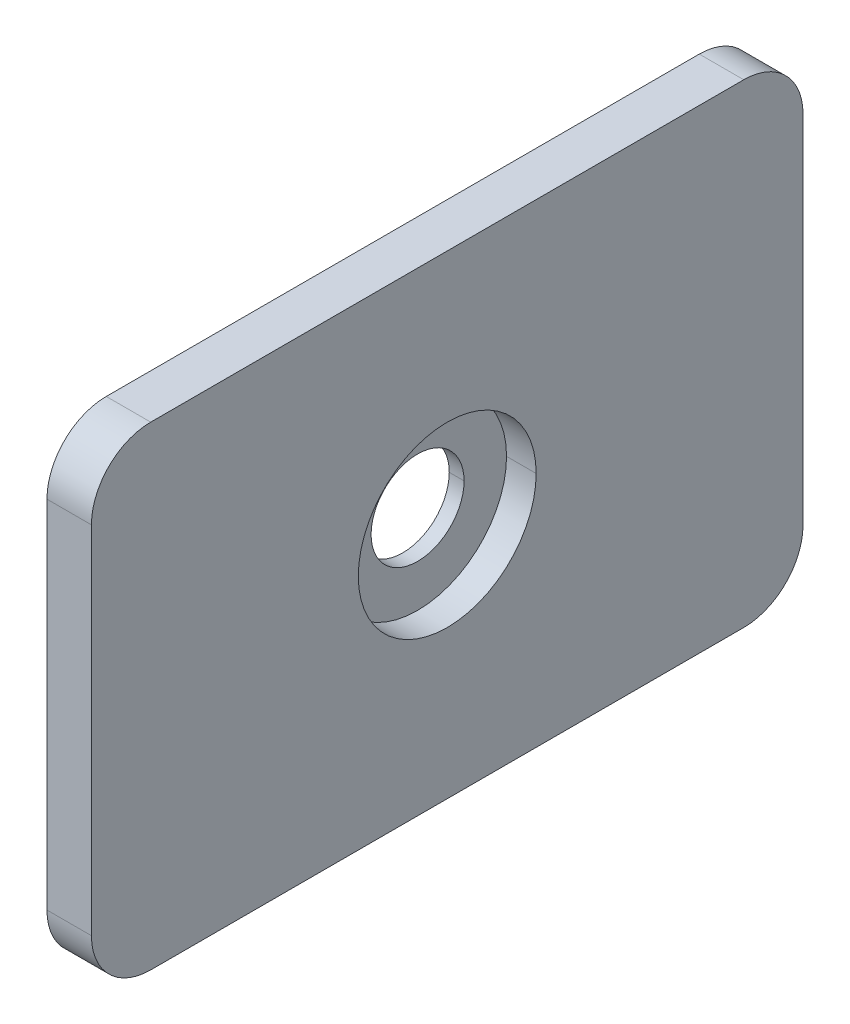
ISO-10303-21;
HEADER;
FILE_DESCRIPTION(('STEP AP214'),'2;1');
FILE_NAME('part.step','',(''),(''),'','','');
FILE_SCHEMA(('AUTOMOTIVE_DESIGN { 1 0 10303 214 1 1 1 1 }'));
ENDSEC;
DATA;
#1=APPLICATION_CONTEXT('core data for automotive mechanical design processes');
#2=APPLICATION_PROTOCOL_DEFINITION('international standard','automotive_design',2000,#1);
#3=PRODUCT_CONTEXT('',#1,'mechanical');
#4=PRODUCT('Part','Part','',(#3));
#5=PRODUCT_RELATED_PRODUCT_CATEGORY('part','',(#4));
#6=PRODUCT_DEFINITION_FORMATION('','',#4);
#7=PRODUCT_DEFINITION_CONTEXT('part definition',#1,'design');
#8=PRODUCT_DEFINITION('design','',#6,#7);
#9=PRODUCT_DEFINITION_SHAPE('','',#8);
#10=(LENGTH_UNIT() NAMED_UNIT(*) SI_UNIT(.MILLI.,.METRE.));
#11=(NAMED_UNIT(*) PLANE_ANGLE_UNIT() SI_UNIT($,.RADIAN.));
#12=(NAMED_UNIT(*) SI_UNIT($,.STERADIAN.) SOLID_ANGLE_UNIT());
#13=UNCERTAINTY_MEASURE_WITH_UNIT(LENGTH_MEASURE(1.E-05),#10,'distance_accuracy_value','');
#14=(GEOMETRIC_REPRESENTATION_CONTEXT(3) GLOBAL_UNCERTAINTY_ASSIGNED_CONTEXT((#13)) GLOBAL_UNIT_ASSIGNED_CONTEXT((#10,
#11,#12)) REPRESENTATION_CONTEXT('',''));
#15=CARTESIAN_POINT('',(0.,0.,0.));
#16=DIRECTION('',(0.,0.,1.));
#17=DIRECTION('',(1.,0.,0.));
#18=AXIS2_PLACEMENT_3D('',#15,#16,#17);
#19=CARTESIAN_POINT('',(-0.396875000000005,0.,0.));
#20=DIRECTION('',(1.,0.,0.));
#21=DIRECTION('',(0.,0.,-1.));
#22=AXIS2_PLACEMENT_3D('',#19,#20,#21);
#23=CYLINDRICAL_SURFACE('',#22,4.7625);
#24=DIRECTION('',(1.,0.,0.));
#25=VECTOR('',#24,1.);
#26=CARTESIAN_POINT('',(-0.396875000000011,0.,4.7625));
#27=LINE('',#26,#25);
#28=CARTESIAN_POINT('',(-0.396875,0.,4.7625));
#29=VERTEX_POINT('',#28);
#30=CARTESIAN_POINT('',(1.190625,0.,4.7625));
#31=VERTEX_POINT('',#30);
#32=EDGE_CURVE('E188',#29,#31,#27,.T.);
#33=ORIENTED_EDGE('',*,*,#32,.F.);
#34=CARTESIAN_POINT('',(-0.396875000000005,0.,0.));
#35=DIRECTION('',(1.,0.,0.));
#36=DIRECTION('',(0.,0.,-1.));
#37=AXIS2_PLACEMENT_3D('',#34,#35,#36);
#38=CIRCLE('',#37,4.7625);
#39=CARTESIAN_POINT('',(-0.396875,0.,-4.7625));
#40=VERTEX_POINT('',#39);
#41=EDGE_CURVE('E11',#40,#29,#38,.T.);
#42=ORIENTED_EDGE('',*,*,#41,.F.);
#43=DIRECTION('',(1.,0.,0.));
#44=VECTOR('',#43,1.);
#45=CARTESIAN_POINT('',(-0.396875,0.,-4.7625));
#46=LINE('',#45,#44);
#47=CARTESIAN_POINT('',(1.190625,0.,-4.7625));
#48=VERTEX_POINT('',#47);
#49=EDGE_CURVE('E182',#40,#48,#46,.T.);
#50=ORIENTED_EDGE('',*,*,#49,.T.);
#51=CARTESIAN_POINT('',(1.190625,0.,0.));
#52=DIRECTION('',(1.,0.,0.));
#53=DIRECTION('',(0.,0.,-1.));
#54=AXIS2_PLACEMENT_3D('',#51,#52,#53);
#55=CIRCLE('',#54,4.7625);
#56=EDGE_CURVE('E216',#48,#31,#55,.T.);
#57=ORIENTED_EDGE('',*,*,#56,.T.);
#58=EDGE_LOOP('',(#33,#42,#50,#57));
#59=FACE_BOUND('',#58,.T.);
#60=ADVANCED_FACE('F17',(#59),#23,.F.);
#61=CARTESIAN_POINT('',(-0.396875000000005,0.,0.));
#62=DIRECTION('',(1.,0.,0.));
#63=DIRECTION('',(0.,0.,1.));
#64=AXIS2_PLACEMENT_3D('',#61,#62,#63);
#65=PLANE('',#64);
#66=CARTESIAN_POINT('',(-0.396875000000005,0.,0.));
#67=DIRECTION('',(-1.,0.,0.));
#68=DIRECTION('',(0.,0.,-1.));
#69=AXIS2_PLACEMENT_3D('',#66,#67,#68);
#70=CIRCLE('',#69,2.4892);
#71=CARTESIAN_POINT('',(-0.396875,0.,-2.4892));
#72=VERTEX_POINT('',#71);
#73=CARTESIAN_POINT('',(-0.396875,0.,2.4892));
#74=VERTEX_POINT('',#73);
#75=EDGE_CURVE('E373',#72,#74,#70,.T.);
#76=ORIENTED_EDGE('',*,*,#75,.T.);
#77=CARTESIAN_POINT('',(-0.396875000000005,0.,0.));
#78=DIRECTION('',(-1.,0.,0.));
#79=DIRECTION('',(0.,0.,-1.));
#80=AXIS2_PLACEMENT_3D('',#77,#78,#79);
#81=CIRCLE('',#80,2.4892);
#82=EDGE_CURVE('E178',#74,#72,#81,.T.);
#83=ORIENTED_EDGE('',*,*,#82,.T.);
#84=EDGE_LOOP('',(#76,#83));
#85=FACE_BOUND('',#84,.T.);
#86=ORIENTED_EDGE('',*,*,#41,.T.);
#87=CARTESIAN_POINT('',(-0.396875000000005,0.,0.));
#88=DIRECTION('',(1.,0.,0.));
#89=DIRECTION('',(0.,0.,-1.));
#90=AXIS2_PLACEMENT_3D('',#87,#88,#89);
#91=CIRCLE('',#90,4.7625);
#92=EDGE_CURVE('E192',#29,#40,#91,.T.);
#93=ORIENTED_EDGE('',*,*,#92,.T.);
#94=EDGE_LOOP('',(#86,#93));
#95=FACE_BOUND('',#94,.T.);
#96=ADVANCED_FACE('F19',(#85,#95),#65,.T.);
#97=CARTESIAN_POINT('',(1.190625,9.525,15.875));
#98=DIRECTION('',(-1.,0.,0.));
#99=DIRECTION('',(0.,0.,1.));
#100=AXIS2_PLACEMENT_3D('',#97,#98,#99);
#101=CYLINDRICAL_SURFACE('',#100,3.175);
#102=CARTESIAN_POINT('',(1.190625,9.525,15.875));
#103=DIRECTION('',(1.,0.,0.));
#104=DIRECTION('',(0.,0.,1.));
#105=AXIS2_PLACEMENT_3D('',#102,#103,#104);
#106=CIRCLE('',#105,3.175);
#107=CARTESIAN_POINT('',(1.190625,12.7,15.875));
#108=VERTEX_POINT('',#107);
#109=CARTESIAN_POINT('',(1.19062499999998,9.525,19.05));
#110=VERTEX_POINT('',#109);
#111=EDGE_CURVE('E132',#108,#110,#106,.T.);
#112=ORIENTED_EDGE('',*,*,#111,.F.);
#113=DIRECTION('',(1.,0.,0.));
#114=VECTOR('',#113,1.);
#115=CARTESIAN_POINT('',(1.190625,12.7,15.875));
#116=LINE('',#115,#114);
#117=CARTESIAN_POINT('',(-1.190625,12.7,15.875));
#118=VERTEX_POINT('',#117);
#119=EDGE_CURVE('E135',#118,#108,#116,.T.);
#120=ORIENTED_EDGE('',*,*,#119,.F.);
#121=CARTESIAN_POINT('',(-1.190625,9.525,15.875));
#122=DIRECTION('',(-1.,0.,0.));
#123=DIRECTION('',(0.,0.,1.));
#124=AXIS2_PLACEMENT_3D('',#121,#122,#123);
#125=CIRCLE('',#124,3.175);
#126=CARTESIAN_POINT('',(-1.19062500000002,9.525,19.05));
#127=VERTEX_POINT('',#126);
#128=EDGE_CURVE('E174',#127,#118,#125,.T.);
#129=ORIENTED_EDGE('',*,*,#128,.F.);
#130=DIRECTION('',(-1.,0.,0.));
#131=VECTOR('',#130,1.);
#132=CARTESIAN_POINT('',(1.19062499999998,9.525,19.05));
#133=LINE('',#132,#131);
#134=EDGE_CURVE('E138',#110,#127,#133,.T.);
#135=ORIENTED_EDGE('',*,*,#134,.F.);
#136=EDGE_LOOP('',(#112,#120,#129,#135));
#137=FACE_BOUND('',#136,.T.);
#138=ADVANCED_FACE('F134',(#137),#101,.T.);
#139=CARTESIAN_POINT('',(1.19062500000002,9.525,-15.875));
#140=DIRECTION('',(-1.,0.,0.));
#141=DIRECTION('',(0.,0.,1.));
#142=AXIS2_PLACEMENT_3D('',#139,#140,#141);
#143=CYLINDRICAL_SURFACE('',#142,3.175);
#144=CARTESIAN_POINT('',(1.19062500000002,9.525,-15.875));
#145=DIRECTION('',(1.,0.,0.));
#146=DIRECTION('',(0.,0.,1.));
#147=AXIS2_PLACEMENT_3D('',#144,#145,#146);
#148=CIRCLE('',#147,3.175);
#149=CARTESIAN_POINT('',(1.19062500000002,9.525,-19.05));
#150=VERTEX_POINT('',#149);
#151=CARTESIAN_POINT('',(1.19062500000002,12.7,-15.875));
#152=VERTEX_POINT('',#151);
#153=EDGE_CURVE('E142',#150,#152,#148,.T.);
#154=ORIENTED_EDGE('',*,*,#153,.F.);
#155=DIRECTION('',(1.,0.,0.));
#156=VECTOR('',#155,1.);
#157=CARTESIAN_POINT('',(1.19062500000002,9.525,-19.05));
#158=LINE('',#157,#156);
#159=CARTESIAN_POINT('',(-1.190625,9.525,-19.05));
#160=VERTEX_POINT('',#159);
#161=EDGE_CURVE('E159',#160,#150,#158,.T.);
#162=ORIENTED_EDGE('',*,*,#161,.F.);
#163=CARTESIAN_POINT('',(-1.190625,9.525,-15.875));
#164=DIRECTION('',(-1.,0.,0.));
#165=DIRECTION('',(0.,0.,1.));
#166=AXIS2_PLACEMENT_3D('',#163,#164,#165);
#167=CIRCLE('',#166,3.175);
#168=CARTESIAN_POINT('',(-1.190625,12.7,-15.875));
#169=VERTEX_POINT('',#168);
#170=EDGE_CURVE('E28',#169,#160,#167,.T.);
#171=ORIENTED_EDGE('',*,*,#170,.F.);
#172=DIRECTION('',(-1.,0.,0.));
#173=VECTOR('',#172,1.);
#174=CARTESIAN_POINT('',(1.19062500000002,12.7,-15.875));
#175=LINE('',#174,#173);
#176=EDGE_CURVE('E158',#152,#169,#175,.T.);
#177=ORIENTED_EDGE('',*,*,#176,.F.);
#178=EDGE_LOOP('',(#154,#162,#171,#177));
#179=FACE_BOUND('',#178,.T.);
#180=ADVANCED_FACE('F458',(#179),#143,.T.);
#181=CARTESIAN_POINT('',(1.190625,-9.525,15.875));
#182=DIRECTION('',(-1.,0.,0.));
#183=DIRECTION('',(0.,0.,1.));
#184=AXIS2_PLACEMENT_3D('',#181,#182,#183);
#185=CYLINDRICAL_SURFACE('',#184,3.175);
#186=CARTESIAN_POINT('',(1.190625,-9.525,15.875));
#187=DIRECTION('',(1.,0.,0.));
#188=DIRECTION('',(0.,0.,1.));
#189=AXIS2_PLACEMENT_3D('',#186,#187,#188);
#190=CIRCLE('',#189,3.175);
#191=CARTESIAN_POINT('',(1.190625,-9.525,19.05));
#192=VERTEX_POINT('',#191);
#193=CARTESIAN_POINT('',(1.19062500000013,-12.7,15.875));
#194=VERTEX_POINT('',#193);
#195=EDGE_CURVE('E43',#192,#194,#190,.T.);
#196=ORIENTED_EDGE('',*,*,#195,.F.);
#197=DIRECTION('',(1.,0.,0.));
#198=VECTOR('',#197,1.);
#199=CARTESIAN_POINT('',(1.190625,-9.525,19.05));
#200=LINE('',#199,#198);
#201=CARTESIAN_POINT('',(-1.19062500000002,-9.525,19.05));
#202=VERTEX_POINT('',#201);
#203=EDGE_CURVE('E171',#202,#192,#200,.T.);
#204=ORIENTED_EDGE('',*,*,#203,.F.);
#205=CARTESIAN_POINT('',(-1.190625,-9.525,15.875));
#206=DIRECTION('',(-1.,0.,0.));
#207=DIRECTION('',(0.,0.,1.));
#208=AXIS2_PLACEMENT_3D('',#205,#206,#207);
#209=CIRCLE('',#208,3.175);
#210=CARTESIAN_POINT('',(-1.1906249999999,-12.7,15.875));
#211=VERTEX_POINT('',#210);
#212=EDGE_CURVE('E177',#211,#202,#209,.T.);
#213=ORIENTED_EDGE('',*,*,#212,.F.);
#214=DIRECTION('',(-1.,0.,0.));
#215=VECTOR('',#214,1.);
#216=CARTESIAN_POINT('',(1.19062500000013,-12.7,15.875));
#217=LINE('',#216,#215);
#218=EDGE_CURVE('E199',#194,#211,#217,.T.);
#219=ORIENTED_EDGE('',*,*,#218,.F.);
#220=EDGE_LOOP('',(#196,#204,#213,#219));
#221=FACE_BOUND('',#220,.T.);
#222=ADVANCED_FACE('F454',(#221),#185,.T.);
#223=CARTESIAN_POINT('',(1.19062500000002,-9.525,-15.875));
#224=DIRECTION('',(-1.,0.,0.));
#225=DIRECTION('',(0.,0.,1.));
#226=AXIS2_PLACEMENT_3D('',#223,#224,#225);
#227=CYLINDRICAL_SURFACE('',#226,3.175);
#228=CARTESIAN_POINT('',(1.19062500000002,-9.525,-15.875));
#229=DIRECTION('',(1.,0.,0.));
#230=DIRECTION('',(0.,0.,1.));
#231=AXIS2_PLACEMENT_3D('',#228,#229,#230);
#232=CIRCLE('',#231,3.175);
#233=CARTESIAN_POINT('',(1.19062500000013,-12.7,-15.875));
#234=VERTEX_POINT('',#233);
#235=CARTESIAN_POINT('',(1.19062500000002,-9.525,-19.05));
#236=VERTEX_POINT('',#235);
#237=EDGE_CURVE('E205',#234,#236,#232,.T.);
#238=ORIENTED_EDGE('',*,*,#237,.F.);
#239=DIRECTION('',(1.,0.,0.));
#240=VECTOR('',#239,1.);
#241=CARTESIAN_POINT('',(1.19062500000013,-12.7,-15.875));
#242=LINE('',#241,#240);
#243=CARTESIAN_POINT('',(-1.19062499999987,-12.7,-15.875));
#244=VERTEX_POINT('',#243);
#245=EDGE_CURVE('E200',#244,#234,#242,.T.);
#246=ORIENTED_EDGE('',*,*,#245,.F.);
#247=CARTESIAN_POINT('',(-1.19062499999998,-9.525,-15.875));
#248=DIRECTION('',(-1.,0.,0.));
#249=DIRECTION('',(0.,0.,1.));
#250=AXIS2_PLACEMENT_3D('',#247,#248,#249);
#251=CIRCLE('',#250,3.175);
#252=CARTESIAN_POINT('',(-1.19062499999998,-9.525,-19.05));
#253=VERTEX_POINT('',#252);
#254=EDGE_CURVE('E225',#253,#244,#251,.T.);
#255=ORIENTED_EDGE('',*,*,#254,.F.);
#256=DIRECTION('',(-1.,0.,0.));
#257=VECTOR('',#256,1.);
#258=CARTESIAN_POINT('',(1.19062500000002,-9.525,-19.05));
#259=LINE('',#258,#257);
#260=EDGE_CURVE('E201',#236,#253,#259,.T.);
#261=ORIENTED_EDGE('',*,*,#260,.F.);
#262=EDGE_LOOP('',(#238,#246,#255,#261));
#263=FACE_BOUND('',#262,.T.);
#264=ADVANCED_FACE('F440',(#263),#227,.T.);
#265=CARTESIAN_POINT('',(-1.190625,0.,0.));
#266=DIRECTION('',(-1.,0.,0.));
#267=DIRECTION('',(0.,0.,1.));
#268=AXIS2_PLACEMENT_3D('',#265,#266,#267);
#269=PLANE('',#268);
#270=CARTESIAN_POINT('',(-1.190625,0.,0.));
#271=DIRECTION('',(1.,0.,0.));
#272=DIRECTION('',(0.,0.,-1.));
#273=AXIS2_PLACEMENT_3D('',#270,#271,#272);
#274=CIRCLE('',#273,2.4892);
#275=CARTESIAN_POINT('',(-1.190625,0.,-2.4892));
#276=VERTEX_POINT('',#275);
#277=CARTESIAN_POINT('',(-1.190625,0.,2.4892));
#278=VERTEX_POINT('',#277);
#279=EDGE_CURVE('E181',#276,#278,#274,.T.);
#280=ORIENTED_EDGE('',*,*,#279,.T.);
#281=CARTESIAN_POINT('',(-1.190625,0.,0.));
#282=DIRECTION('',(1.,0.,0.));
#283=DIRECTION('',(0.,0.,-1.));
#284=AXIS2_PLACEMENT_3D('',#281,#282,#283);
#285=CIRCLE('',#284,2.4892);
#286=EDGE_CURVE('E186',#278,#276,#285,.T.);
#287=ORIENTED_EDGE('',*,*,#286,.T.);
#288=EDGE_LOOP('',(#280,#287));
#289=FACE_BOUND('',#288,.T.);
#290=DIRECTION('',(0.,1.,0.));
#291=VECTOR('',#290,1.);
#292=CARTESIAN_POINT('',(-1.19062499999987,-12.7,-19.05));
#293=LINE('',#292,#291);
#294=EDGE_CURVE('E168',#253,#160,#293,.T.);
#295=ORIENTED_EDGE('',*,*,#294,.F.);
#296=ORIENTED_EDGE('',*,*,#254,.T.);
#297=DIRECTION('',(0.,0.,-1.));
#298=VECTOR('',#297,1.);
#299=CARTESIAN_POINT('',(-1.19062499999992,-12.7,19.05));
#300=LINE('',#299,#298);
#301=EDGE_CURVE('E210',#211,#244,#300,.T.);
#302=ORIENTED_EDGE('',*,*,#301,.F.);
#303=ORIENTED_EDGE('',*,*,#212,.T.);
#304=DIRECTION('',(0.,-1.,0.));
#305=VECTOR('',#304,1.);
#306=CARTESIAN_POINT('',(-1.19062499999992,-12.7,19.05));
#307=LINE('',#306,#305);
#308=EDGE_CURVE('E152',#127,#202,#307,.T.);
#309=ORIENTED_EDGE('',*,*,#308,.F.);
#310=ORIENTED_EDGE('',*,*,#128,.T.);
#311=DIRECTION('',(0.,0.,1.));
#312=VECTOR('',#311,1.);
#313=CARTESIAN_POINT('',(-1.19062500000002,12.7,19.05));
#314=LINE('',#313,#312);
#315=EDGE_CURVE('E150',#169,#118,#314,.T.);
#316=ORIENTED_EDGE('',*,*,#315,.F.);
#317=ORIENTED_EDGE('',*,*,#170,.T.);
#318=EDGE_LOOP('',(#295,#296,#302,#303,#309,#310,#316,#317));
#319=FACE_BOUND('',#318,.T.);
#320=ADVANCED_FACE('F429',(#289,#319),#269,.T.);
#321=CARTESIAN_POINT('',(1.190625,0.,0.));
#322=DIRECTION('',(-1.,0.,0.));
#323=DIRECTION('',(0.,0.,1.));
#324=AXIS2_PLACEMENT_3D('',#321,#322,#323);
#325=PLANE('',#324);
#326=ORIENTED_EDGE('',*,*,#56,.F.);
#327=CARTESIAN_POINT('',(1.190625,0.,0.));
#328=DIRECTION('',(1.,0.,0.));
#329=DIRECTION('',(0.,0.,-1.));
#330=AXIS2_PLACEMENT_3D('',#327,#328,#329);
#331=CIRCLE('',#330,4.7625);
#332=EDGE_CURVE('E187',#31,#48,#331,.T.);
#333=ORIENTED_EDGE('',*,*,#332,.F.);
#334=EDGE_LOOP('',(#326,#333));
#335=FACE_BOUND('',#334,.T.);
#336=DIRECTION('',(0.,0.,-1.));
#337=VECTOR('',#336,1.);
#338=CARTESIAN_POINT('',(1.1906250000001,-12.7,19.05));
#339=LINE('',#338,#337);
#340=EDGE_CURVE('E196',#194,#234,#339,.T.);
#341=ORIENTED_EDGE('',*,*,#340,.T.);
#342=ORIENTED_EDGE('',*,*,#237,.T.);
#343=DIRECTION('',(0.,1.,0.));
#344=VECTOR('',#343,1.);
#345=CARTESIAN_POINT('',(1.19062500000013,-12.7,-19.05));
#346=LINE('',#345,#344);
#347=EDGE_CURVE('E21',#236,#150,#346,.T.);
#348=ORIENTED_EDGE('',*,*,#347,.T.);
#349=ORIENTED_EDGE('',*,*,#153,.T.);
#350=DIRECTION('',(0.,0.,1.));
#351=VECTOR('',#350,1.);
#352=CARTESIAN_POINT('',(1.19062499999998,12.7,19.05));
#353=LINE('',#352,#351);
#354=EDGE_CURVE('E148',#152,#108,#353,.T.);
#355=ORIENTED_EDGE('',*,*,#354,.T.);
#356=ORIENTED_EDGE('',*,*,#111,.T.);
#357=DIRECTION('',(0.,-1.,0.));
#358=VECTOR('',#357,1.);
#359=CARTESIAN_POINT('',(1.1906250000001,-12.7,19.05));
#360=LINE('',#359,#358);
#361=EDGE_CURVE('E211',#110,#192,#360,.T.);
#362=ORIENTED_EDGE('',*,*,#361,.T.);
#363=ORIENTED_EDGE('',*,*,#195,.T.);
#364=EDGE_LOOP('',(#341,#342,#348,#349,#355,#356,#362,#363));
#365=FACE_BOUND('',#364,.T.);
#366=ADVANCED_FACE('F154',(#335,#365),#325,.F.);
#367=CARTESIAN_POINT('',(1.1906250000001,-12.7,19.05));
#368=DIRECTION('',(0.,1.,0.));
#369=DIRECTION('',(1.,0.,0.));
#370=AXIS2_PLACEMENT_3D('',#367,#368,#369);
#371=PLANE('',#370);
#372=ORIENTED_EDGE('',*,*,#301,.T.);
#373=ORIENTED_EDGE('',*,*,#245,.T.);
#374=ORIENTED_EDGE('',*,*,#340,.F.);
#375=ORIENTED_EDGE('',*,*,#218,.T.);
#376=EDGE_LOOP('',(#372,#373,#374,#375));
#377=FACE_BOUND('',#376,.T.);
#378=ADVANCED_FACE('F428',(#377),#371,.F.);
#379=CARTESIAN_POINT('',(1.1906250000001,-12.7,19.05));
#380=DIRECTION('',(0.,0.,-1.));
#381=DIRECTION('',(-1.,0.,0.));
#382=AXIS2_PLACEMENT_3D('',#379,#380,#381);
#383=PLANE('',#382);
#384=ORIENTED_EDGE('',*,*,#308,.T.);
#385=ORIENTED_EDGE('',*,*,#203,.T.);
#386=ORIENTED_EDGE('',*,*,#361,.F.);
#387=ORIENTED_EDGE('',*,*,#134,.T.);
#388=EDGE_LOOP('',(#384,#385,#386,#387));
#389=FACE_BOUND('',#388,.T.);
#390=ADVANCED_FACE('F437',(#389),#383,.F.);
#391=CARTESIAN_POINT('',(1.19062499999998,12.7,19.05));
#392=DIRECTION('',(0.,-1.,0.));
#393=DIRECTION('',(0.,0.,-1.));
#394=AXIS2_PLACEMENT_3D('',#391,#392,#393);
#395=PLANE('',#394);
#396=ORIENTED_EDGE('',*,*,#354,.F.);
#397=ORIENTED_EDGE('',*,*,#176,.T.);
#398=ORIENTED_EDGE('',*,*,#315,.T.);
#399=ORIENTED_EDGE('',*,*,#119,.T.);
#400=EDGE_LOOP('',(#396,#397,#398,#399));
#401=FACE_BOUND('',#400,.T.);
#402=ADVANCED_FACE('F146',(#401),#395,.F.);
#403=CARTESIAN_POINT('',(1.19062500000013,-12.7,-19.05));
#404=DIRECTION('',(0.,0.,1.));
#405=DIRECTION('',(1.,0.,0.));
#406=AXIS2_PLACEMENT_3D('',#403,#404,#405);
#407=PLANE('',#406);
#408=ORIENTED_EDGE('',*,*,#347,.F.);
#409=ORIENTED_EDGE('',*,*,#260,.T.);
#410=ORIENTED_EDGE('',*,*,#294,.T.);
#411=ORIENTED_EDGE('',*,*,#161,.T.);
#412=EDGE_LOOP('',(#408,#409,#410,#411));
#413=FACE_BOUND('',#412,.T.);
#414=ADVANCED_FACE('F459',(#413),#407,.F.);
#415=CARTESIAN_POINT('',(-1.190625,0.,0.));
#416=DIRECTION('',(1.,0.,0.));
#417=DIRECTION('',(0.,0.,-1.));
#418=AXIS2_PLACEMENT_3D('',#415,#416,#417);
#419=CYLINDRICAL_SURFACE('',#418,2.4892);
#420=DIRECTION('',(1.,0.,0.));
#421=VECTOR('',#420,1.);
#422=CARTESIAN_POINT('',(-1.190625,0.,2.4892));
#423=LINE('',#422,#421);
#424=EDGE_CURVE('E368',#278,#74,#423,.T.);
#425=ORIENTED_EDGE('',*,*,#424,.F.);
#426=ORIENTED_EDGE('',*,*,#279,.F.);
#427=DIRECTION('',(1.,0.,0.));
#428=VECTOR('',#427,1.);
#429=CARTESIAN_POINT('',(-1.190625,0.,-2.4892));
#430=LINE('',#429,#428);
#431=EDGE_CURVE('E194',#276,#72,#430,.T.);
#432=ORIENTED_EDGE('',*,*,#431,.T.);
#433=ORIENTED_EDGE('',*,*,#82,.F.);
#434=EDGE_LOOP('',(#425,#426,#432,#433));
#435=FACE_BOUND('',#434,.T.);
#436=ADVANCED_FACE('F462',(#435),#419,.F.);
#437=CARTESIAN_POINT('',(-1.190625,0.,0.));
#438=DIRECTION('',(1.,0.,0.));
#439=DIRECTION('',(0.,0.,-1.));
#440=AXIS2_PLACEMENT_3D('',#437,#438,#439);
#441=CYLINDRICAL_SURFACE('',#440,2.4892);
#442=ORIENTED_EDGE('',*,*,#286,.F.);
#443=ORIENTED_EDGE('',*,*,#424,.T.);
#444=ORIENTED_EDGE('',*,*,#75,.F.);
#445=ORIENTED_EDGE('',*,*,#431,.F.);
#446=EDGE_LOOP('',(#442,#443,#444,#445));
#447=FACE_BOUND('',#446,.T.);
#448=ADVANCED_FACE('F469',(#447),#441,.F.);
#449=CARTESIAN_POINT('',(-0.396875000000005,0.,0.));
#450=DIRECTION('',(1.,0.,0.));
#451=DIRECTION('',(0.,0.,-1.));
#452=AXIS2_PLACEMENT_3D('',#449,#450,#451);
#453=CYLINDRICAL_SURFACE('',#452,4.7625);
#454=ORIENTED_EDGE('',*,*,#92,.F.);
#455=ORIENTED_EDGE('',*,*,#32,.T.);
#456=ORIENTED_EDGE('',*,*,#332,.T.);
#457=ORIENTED_EDGE('',*,*,#49,.F.);
#458=EDGE_LOOP('',(#454,#455,#456,#457));
#459=FACE_BOUND('',#458,.T.);
#460=ADVANCED_FACE('F423',(#459),#453,.F.);
#461=CLOSED_SHELL('',(#60,#96,#138,#180,#222,#264,#320,#366,#378,#390,#402,#414,#436,#448,#460));
#462=MANIFOLD_SOLID_BREP('B1',#461);
#463=ADVANCED_BREP_SHAPE_REPRESENTATION('',(#18,#462),#14);
#464=SHAPE_DEFINITION_REPRESENTATION(#9,#463);
ENDSEC;
END-ISO-10303-21;
